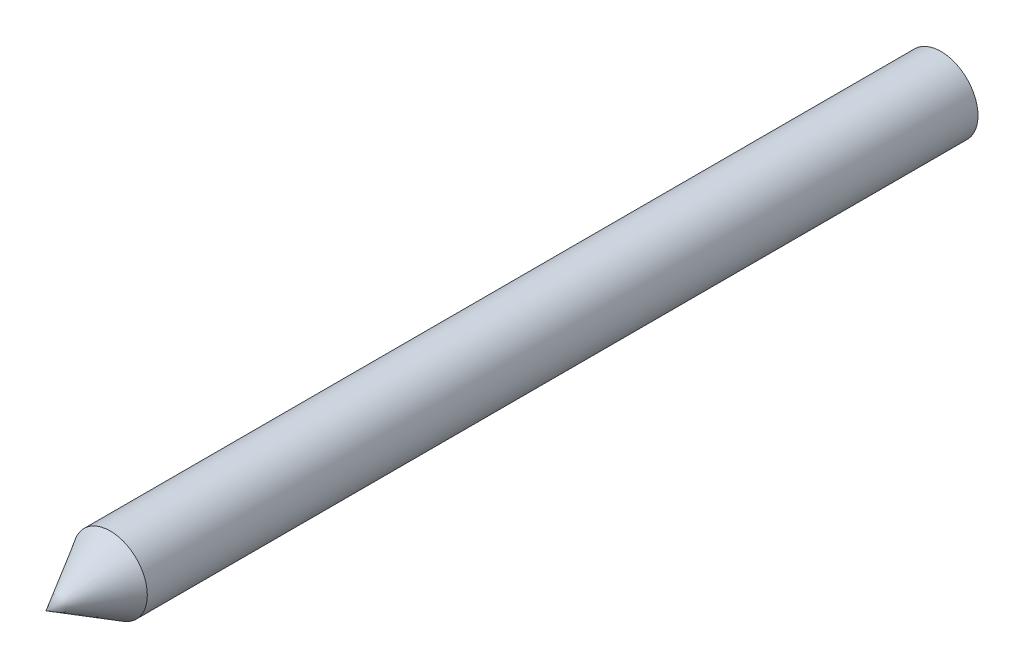
ISO-10303-21;
HEADER;
FILE_DESCRIPTION(('STEP AP214'),'2;1');
FILE_NAME('part.step','',(''),(''),'','','');
FILE_SCHEMA(('AUTOMOTIVE_DESIGN { 1 0 10303 214 1 1 1 1 }'));
ENDSEC;
DATA;
#1=APPLICATION_CONTEXT('core data for automotive mechanical design processes');
#2=APPLICATION_PROTOCOL_DEFINITION('international standard','automotive_design',2000,#1);
#3=PRODUCT_CONTEXT('',#1,'mechanical');
#4=PRODUCT('Part','Part','',(#3));
#5=PRODUCT_RELATED_PRODUCT_CATEGORY('part','',(#4));
#6=PRODUCT_DEFINITION_FORMATION('','',#4);
#7=PRODUCT_DEFINITION_CONTEXT('part definition',#1,'design');
#8=PRODUCT_DEFINITION('design','',#6,#7);
#9=PRODUCT_DEFINITION_SHAPE('','',#8);
#10=(LENGTH_UNIT() NAMED_UNIT(*) SI_UNIT(.MILLI.,.METRE.));
#11=(NAMED_UNIT(*) PLANE_ANGLE_UNIT() SI_UNIT($,.RADIAN.));
#12=(NAMED_UNIT(*) SI_UNIT($,.STERADIAN.) SOLID_ANGLE_UNIT());
#13=UNCERTAINTY_MEASURE_WITH_UNIT(LENGTH_MEASURE(1.E-05),#10,'distance_accuracy_value','');
#14=(GEOMETRIC_REPRESENTATION_CONTEXT(3) GLOBAL_UNCERTAINTY_ASSIGNED_CONTEXT((#13)) GLOBAL_UNIT_ASSIGNED_CONTEXT((#10,
#11,#12)) REPRESENTATION_CONTEXT('',''));
#15=CARTESIAN_POINT('',(0.,0.,0.));
#16=DIRECTION('',(0.,0.,1.));
#17=DIRECTION('',(1.,0.,0.));
#18=AXIS2_PLACEMENT_3D('',#15,#16,#17);
#19=CARTESIAN_POINT('',(0.,0.,88.9));
#20=DIRECTION('',(0.,0.,-1.));
#21=DIRECTION('',(-1.,0.,0.));
#22=AXIS2_PLACEMENT_3D('',#19,#20,#21);
#23=CYLINDRICAL_SURFACE('',#22,7.9375);
#24=CARTESIAN_POINT('',(0.,0.,88.9));
#25=DIRECTION('',(0.,0.,1.));
#26=DIRECTION('',(1.,0.,0.));
#27=AXIS2_PLACEMENT_3D('',#24,#25,#26);
#28=CIRCLE('',#27,7.9375);
#29=CARTESIAN_POINT('',(7.9375,0.,88.9));
#30=VERTEX_POINT('',#29);
#31=EDGE_CURVE('E11',#30,#30,#28,.T.);
#32=ORIENTED_EDGE('',*,*,#31,.F.);
#33=EDGE_LOOP('',(#32));
#34=FACE_BOUND('',#33,.T.);
#35=CARTESIAN_POINT('',(0.,0.,-88.9));
#36=DIRECTION('',(0.,0.,1.));
#37=DIRECTION('',(1.,0.,0.));
#38=AXIS2_PLACEMENT_3D('',#35,#36,#37);
#39=CIRCLE('',#38,7.9375);
#40=CARTESIAN_POINT('',(7.9375,0.,-88.9));
#41=VERTEX_POINT('',#40);
#42=EDGE_CURVE('E36',#41,#41,#39,.T.);
#43=ORIENTED_EDGE('',*,*,#42,.T.);
#44=EDGE_LOOP('',(#43));
#45=FACE_BOUND('',#44,.T.);
#46=ADVANCED_FACE('F33',(#34,#45),#23,.T.);
#47=CARTESIAN_POINT('',(0.,0.,-88.9));
#48=DIRECTION('',(0.,0.,1.));
#49=DIRECTION('',(1.,0.,0.));
#50=AXIS2_PLACEMENT_3D('',#47,#48,#49);
#51=PLANE('',#50);
#52=ORIENTED_EDGE('',*,*,#42,.F.);
#53=EDGE_LOOP('',(#52));
#54=FACE_BOUND('',#53,.T.);
#55=ADVANCED_FACE('F45',(#54),#51,.F.);
#56=CARTESIAN_POINT('',(0.,0.,88.9));
#57=DIRECTION('',(0.,0.,-1.));
#58=DIRECTION('',(-1.,0.,0.));
#59=AXIS2_PLACEMENT_3D('',#56,#57,#58);
#60=CONICAL_SURFACE('',#59,7.9375,0.523598775598292);
#61=CARTESIAN_POINT('',(0.,0.,102.648153285078));
#62=VERTEX_POINT('',#61);
#63=VERTEX_LOOP('',#62);
#64=FACE_BOUND('',#63,.T.);
#65=ORIENTED_EDGE('',*,*,#31,.T.);
#66=EDGE_LOOP('',(#65));
#67=FACE_BOUND('',#66,.T.);
#68=ADVANCED_FACE('F42',(#64,#67),#60,.T.);
#69=CLOSED_SHELL('',(#46,#55,#68));
#70=MANIFOLD_SOLID_BREP('B2',#69);
#71=ADVANCED_BREP_SHAPE_REPRESENTATION('',(#18,#70),#14);
#72=SHAPE_DEFINITION_REPRESENTATION(#9,#71);
ENDSEC;
END-ISO-10303-21;
